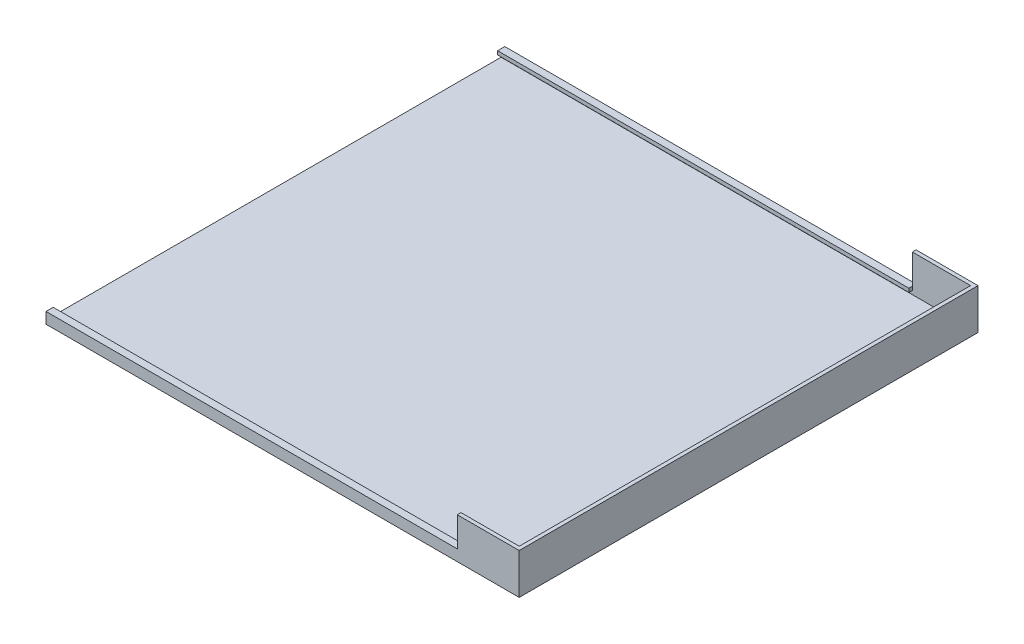
ISO-10303-21;
HEADER;
FILE_DESCRIPTION(('STEP AP214'),'2;1');
FILE_NAME('part.step','',(''),(''),'','','');
FILE_SCHEMA(('AUTOMOTIVE_DESIGN { 1 0 10303 214 1 1 1 1 }'));
ENDSEC;
DATA;
#1=APPLICATION_CONTEXT('core data for automotive mechanical design processes');
#2=APPLICATION_PROTOCOL_DEFINITION('international standard','automotive_design',2000,#1);
#3=PRODUCT_CONTEXT('',#1,'mechanical');
#4=PRODUCT('Part','Part','',(#3));
#5=PRODUCT_RELATED_PRODUCT_CATEGORY('part','',(#4));
#6=PRODUCT_DEFINITION_FORMATION('','',#4);
#7=PRODUCT_DEFINITION_CONTEXT('part definition',#1,'design');
#8=PRODUCT_DEFINITION('design','',#6,#7);
#9=PRODUCT_DEFINITION_SHAPE('','',#8);
#10=(LENGTH_UNIT() NAMED_UNIT(*) SI_UNIT(.MILLI.,.METRE.));
#11=(NAMED_UNIT(*) PLANE_ANGLE_UNIT() SI_UNIT($,.RADIAN.));
#12=(NAMED_UNIT(*) SI_UNIT($,.STERADIAN.) SOLID_ANGLE_UNIT());
#13=UNCERTAINTY_MEASURE_WITH_UNIT(LENGTH_MEASURE(1.E-05),#10,'distance_accuracy_value','');
#14=(GEOMETRIC_REPRESENTATION_CONTEXT(3) GLOBAL_UNCERTAINTY_ASSIGNED_CONTEXT((#13)) GLOBAL_UNIT_ASSIGNED_CONTEXT((#10,
#11,#12)) REPRESENTATION_CONTEXT('',''));
#15=CARTESIAN_POINT('',(0.,0.,0.));
#16=DIRECTION('',(0.,0.,1.));
#17=DIRECTION('',(1.,0.,0.));
#18=AXIS2_PLACEMENT_3D('',#15,#16,#17);
#19=CARTESIAN_POINT('',(0.,2.,0.));
#20=DIRECTION('',(0.,1.,0.));
#21=DIRECTION('',(0.,0.,1.));
#22=AXIS2_PLACEMENT_3D('',#19,#20,#21);
#23=PLANE('',#22);
#24=DIRECTION('',(0.,0.,1.));
#25=VECTOR('',#24,1.);
#26=CARTESIAN_POINT('',(126.,2.,122.1));
#27=LINE('',#26,#25);
#28=CARTESIAN_POINT('',(126.,2.,-122.1));
#29=VERTEX_POINT('',#28);
#30=CARTESIAN_POINT('',(126.,2.,122.1));
#31=VERTEX_POINT('',#30);
#32=EDGE_CURVE('E194',#29,#31,#27,.T.);
#33=ORIENTED_EDGE('',*,*,#32,.F.);
#34=DIRECTION('',(1.,0.,0.));
#35=VECTOR('',#34,1.);
#36=CARTESIAN_POINT('',(-128.,2.,-122.1));
#37=LINE('',#36,#35);
#38=CARTESIAN_POINT('',(-128.,2.,-122.1));
#39=VERTEX_POINT('',#38);
#40=EDGE_CURVE('E61',#39,#29,#37,.T.);
#41=ORIENTED_EDGE('',*,*,#40,.F.);
#42=DIRECTION('',(0.,0.,1.));
#43=VECTOR('',#42,1.);
#44=CARTESIAN_POINT('',(-128.,2.,-124.1));
#45=LINE('',#44,#43);
#46=CARTESIAN_POINT('',(-128.,2.,122.1));
#47=VERTEX_POINT('',#46);
#48=EDGE_CURVE('E179',#39,#47,#45,.T.);
#49=ORIENTED_EDGE('',*,*,#48,.T.);
#50=DIRECTION('',(-1.,0.,0.));
#51=VECTOR('',#50,1.);
#52=CARTESIAN_POINT('',(-128.,2.,122.1));
#53=LINE('',#52,#51);
#54=EDGE_CURVE('E68',#31,#47,#53,.T.);
#55=ORIENTED_EDGE('',*,*,#54,.F.);
#56=EDGE_LOOP('',(#33,#41,#49,#55));
#57=FACE_BOUND('',#56,.T.);
#58=ADVANCED_FACE('F45',(#57),#23,.T.);
#59=CARTESIAN_POINT('',(94.5000000000001,12.,-124.1));
#60=DIRECTION('',(1.,0.,0.));
#61=DIRECTION('',(0.,0.,-1.));
#62=AXIS2_PLACEMENT_3D('',#59,#60,#61);
#63=PLANE('',#62);
#64=DIRECTION('',(0.,0.,-1.));
#65=VECTOR('',#64,1.);
#66=CARTESIAN_POINT('',(94.5000000000001,4.,-120.21));
#67=LINE('',#66,#65);
#68=CARTESIAN_POINT('',(94.5000000000001,4.,-120.21));
#69=VERTEX_POINT('',#68);
#70=CARTESIAN_POINT('',(94.5000000000001,4.,-122.1));
#71=VERTEX_POINT('',#70);
#72=EDGE_CURVE('E238',#69,#71,#67,.T.);
#73=ORIENTED_EDGE('',*,*,#72,.T.);
#74=DIRECTION('',(0.,1.,0.));
#75=VECTOR('',#74,1.);
#76=CARTESIAN_POINT('',(94.5000000000001,12.,-122.1));
#77=LINE('',#76,#75);
#78=CARTESIAN_POINT('',(94.5000000000001,6.,-122.1));
#79=VERTEX_POINT('',#78);
#80=EDGE_CURVE('E11',#71,#79,#77,.T.);
#81=ORIENTED_EDGE('',*,*,#80,.T.);
#82=DIRECTION('',(0.,0.,-1.));
#83=VECTOR('',#82,1.);
#84=CARTESIAN_POINT('',(94.5000000000001,6.,0.));
#85=LINE('',#84,#83);
#86=CARTESIAN_POINT('',(94.5000000000001,6.,-120.21));
#87=VERTEX_POINT('',#86);
#88=EDGE_CURVE('E242',#87,#79,#85,.T.);
#89=ORIENTED_EDGE('',*,*,#88,.F.);
#90=DIRECTION('',(0.,1.,0.));
#91=VECTOR('',#90,1.);
#92=CARTESIAN_POINT('',(94.5000000000001,0.,-120.21));
#93=LINE('',#92,#91);
#94=EDGE_CURVE('E336',#69,#87,#93,.T.);
#95=ORIENTED_EDGE('',*,*,#94,.F.);
#96=EDGE_LOOP('',(#73,#81,#89,#95));
#97=FACE_BOUND('',#96,.T.);
#98=ADVANCED_FACE('F413',(#97),#63,.T.);
#99=CARTESIAN_POINT('',(94.5000000000001,12.,120.21));
#100=DIRECTION('',(1.,0.,0.));
#101=DIRECTION('',(0.,0.,-1.));
#102=AXIS2_PLACEMENT_3D('',#99,#100,#101);
#103=PLANE('',#102);
#104=DIRECTION('',(0.,0.,1.));
#105=VECTOR('',#104,1.);
#106=CARTESIAN_POINT('',(94.5000000000001,6.,0.));
#107=LINE('',#106,#105);
#108=CARTESIAN_POINT('',(94.5000000000001,6.,120.21));
#109=VERTEX_POINT('',#108);
#110=CARTESIAN_POINT('',(94.5000000000001,6.,122.1));
#111=VERTEX_POINT('',#110);
#112=EDGE_CURVE('E250',#109,#111,#107,.T.);
#113=ORIENTED_EDGE('',*,*,#112,.T.);
#114=DIRECTION('',(0.,-1.,0.));
#115=VECTOR('',#114,1.);
#116=CARTESIAN_POINT('',(94.5000000000001,12.,122.1));
#117=LINE('',#116,#115);
#118=CARTESIAN_POINT('',(94.5000000000001,4.00058035191791,122.1));
#119=VERTEX_POINT('',#118);
#120=EDGE_CURVE('E54',#111,#119,#117,.T.);
#121=ORIENTED_EDGE('',*,*,#120,.T.);
#122=DIRECTION('',(0.,0.,-1.));
#123=VECTOR('',#122,1.);
#124=CARTESIAN_POINT('',(94.5000000000001,4.00058035191792,120.21));
#125=LINE('',#124,#123);
#126=CARTESIAN_POINT('',(94.5000000000001,4.00058035191792,120.21));
#127=VERTEX_POINT('',#126);
#128=EDGE_CURVE('E246',#119,#127,#125,.T.);
#129=ORIENTED_EDGE('',*,*,#128,.T.);
#130=DIRECTION('',(0.,-1.,0.));
#131=VECTOR('',#130,1.);
#132=CARTESIAN_POINT('',(94.5000000000001,0.,120.21));
#133=LINE('',#132,#131);
#134=EDGE_CURVE('E340',#109,#127,#133,.T.);
#135=ORIENTED_EDGE('',*,*,#134,.F.);
#136=EDGE_LOOP('',(#113,#121,#129,#135));
#137=FACE_BOUND('',#136,.T.);
#138=ADVANCED_FACE('F347',(#137),#103,.T.);
#139=CARTESIAN_POINT('',(-128.,6.,-122.1));
#140=DIRECTION('',(0.,0.,-1.));
#141=DIRECTION('',(-1.,0.,0.));
#142=AXIS2_PLACEMENT_3D('',#139,#140,#141);
#143=PLANE('',#142);
#144=ORIENTED_EDGE('',*,*,#40,.T.);
#145=DIRECTION('',(0.,-1.,0.));
#146=VECTOR('',#145,1.);
#147=CARTESIAN_POINT('',(126.,22.,-122.1));
#148=LINE('',#147,#146);
#149=CARTESIAN_POINT('',(126.,22.,-122.1));
#150=VERTEX_POINT('',#149);
#151=EDGE_CURVE('E226',#150,#29,#148,.T.);
#152=ORIENTED_EDGE('',*,*,#151,.F.);
#153=DIRECTION('',(1.,0.,0.));
#154=VECTOR('',#153,1.);
#155=CARTESIAN_POINT('',(126.,22.,-122.1));
#156=LINE('',#155,#154);
#157=CARTESIAN_POINT('',(94.5000000000001,22.,-122.1));
#158=VERTEX_POINT('',#157);
#159=EDGE_CURVE('E204',#158,#150,#156,.T.);
#160=ORIENTED_EDGE('',*,*,#159,.F.);
#161=DIRECTION('',(0.,-1.,0.));
#162=VECTOR('',#161,1.);
#163=CARTESIAN_POINT('',(94.5000000000001,22.,-122.1));
#164=LINE('',#163,#162);
#165=EDGE_CURVE('E230',#158,#79,#164,.T.);
#166=ORIENTED_EDGE('',*,*,#165,.T.);
#167=ORIENTED_EDGE('',*,*,#80,.F.);
#168=DIRECTION('',(1.,0.,0.));
#169=VECTOR('',#168,1.);
#170=CARTESIAN_POINT('',(-128.,4.,-122.1));
#171=LINE('',#170,#169);
#172=CARTESIAN_POINT('',(-128.,4.,-122.1));
#173=VERTEX_POINT('',#172);
#174=EDGE_CURVE('E254',#173,#71,#171,.T.);
#175=ORIENTED_EDGE('',*,*,#174,.F.);
#176=DIRECTION('',(0.,-1.,0.));
#177=VECTOR('',#176,1.);
#178=CARTESIAN_POINT('',(-128.,6.,-122.1));
#179=LINE('',#178,#177);
#180=EDGE_CURVE('E290',#173,#39,#179,.T.);
#181=ORIENTED_EDGE('',*,*,#180,.T.);
#182=EDGE_LOOP('',(#144,#152,#160,#166,#167,#175,#181));
#183=FACE_BOUND('',#182,.T.);
#184=ADVANCED_FACE('F380',(#183),#143,.F.);
#185=CARTESIAN_POINT('',(-128.,6.,122.1));
#186=DIRECTION('',(0.,0.,1.));
#187=DIRECTION('',(1.,0.,0.));
#188=AXIS2_PLACEMENT_3D('',#185,#186,#187);
#189=PLANE('',#188);
#190=DIRECTION('',(-1.,0.,0.));
#191=VECTOR('',#190,1.);
#192=CARTESIAN_POINT('',(128.,4.00058035191792,122.1));
#193=LINE('',#192,#191);
#194=CARTESIAN_POINT('',(-128.,4.00058035191792,122.1));
#195=VERTEX_POINT('',#194);
#196=EDGE_CURVE('E272',#119,#195,#193,.T.);
#197=ORIENTED_EDGE('',*,*,#196,.F.);
#198=ORIENTED_EDGE('',*,*,#120,.F.);
#199=DIRECTION('',(0.,-1.,0.));
#200=VECTOR('',#199,1.);
#201=CARTESIAN_POINT('',(94.5000000000001,22.,122.1));
#202=LINE('',#201,#200);
#203=CARTESIAN_POINT('',(94.5000000000001,22.,122.1));
#204=VERTEX_POINT('',#203);
#205=EDGE_CURVE('E218',#204,#111,#202,.T.);
#206=ORIENTED_EDGE('',*,*,#205,.F.);
#207=DIRECTION('',(-1.,0.,0.));
#208=VECTOR('',#207,1.);
#209=CARTESIAN_POINT('',(94.5000000000001,22.,122.1));
#210=LINE('',#209,#208);
#211=CARTESIAN_POINT('',(126.,22.,122.1));
#212=VERTEX_POINT('',#211);
#213=EDGE_CURVE('E210',#212,#204,#210,.T.);
#214=ORIENTED_EDGE('',*,*,#213,.F.);
#215=DIRECTION('',(0.,-1.,0.));
#216=VECTOR('',#215,1.);
#217=CARTESIAN_POINT('',(126.,22.,122.1));
#218=LINE('',#217,#216);
#219=EDGE_CURVE('E222',#212,#31,#218,.T.);
#220=ORIENTED_EDGE('',*,*,#219,.T.);
#221=ORIENTED_EDGE('',*,*,#54,.T.);
#222=DIRECTION('',(0.,-1.,0.));
#223=VECTOR('',#222,1.);
#224=CARTESIAN_POINT('',(-128.,6.,122.1));
#225=LINE('',#224,#223);
#226=EDGE_CURVE('E298',#195,#47,#225,.T.);
#227=ORIENTED_EDGE('',*,*,#226,.F.);
#228=EDGE_LOOP('',(#197,#198,#206,#214,#220,#221,#227));
#229=FACE_BOUND('',#228,.T.);
#230=ADVANCED_FACE('F352',(#229),#189,.F.);
#231=CARTESIAN_POINT('',(128.,2.,-124.1));
#232=DIRECTION('',(-1.,0.,0.));
#233=DIRECTION('',(0.,0.,1.));
#234=AXIS2_PLACEMENT_3D('',#231,#232,#233);
#235=PLANE('',#234);
#236=DIRECTION('',(0.,-1.,0.));
#237=VECTOR('',#236,1.);
#238=CARTESIAN_POINT('',(128.,2.,-124.1));
#239=LINE('',#238,#237);
#240=CARTESIAN_POINT('',(128.,22.,-124.1));
#241=VERTEX_POINT('',#240);
#242=CARTESIAN_POINT('',(128.,0.,-124.1));
#243=VERTEX_POINT('',#242);
#244=EDGE_CURVE('E183',#241,#243,#239,.T.);
#245=ORIENTED_EDGE('',*,*,#244,.F.);
#246=DIRECTION('',(0.,0.,-1.));
#247=VECTOR('',#246,1.);
#248=CARTESIAN_POINT('',(128.,22.,124.1));
#249=LINE('',#248,#247);
#250=CARTESIAN_POINT('',(128.,22.,124.1));
#251=VERTEX_POINT('',#250);
#252=EDGE_CURVE('E182',#251,#241,#249,.T.);
#253=ORIENTED_EDGE('',*,*,#252,.F.);
#254=DIRECTION('',(0.,-1.,0.));
#255=VECTOR('',#254,1.);
#256=CARTESIAN_POINT('',(128.,2.,124.1));
#257=LINE('',#256,#255);
#258=CARTESIAN_POINT('',(128.,0.,124.1));
#259=VERTEX_POINT('',#258);
#260=EDGE_CURVE('E165',#251,#259,#257,.T.);
#261=ORIENTED_EDGE('',*,*,#260,.T.);
#262=DIRECTION('',(0.,0.,-1.));
#263=VECTOR('',#262,1.);
#264=CARTESIAN_POINT('',(128.,0.,-124.1));
#265=LINE('',#264,#263);
#266=EDGE_CURVE('E304',#259,#243,#265,.T.);
#267=ORIENTED_EDGE('',*,*,#266,.T.);
#268=EDGE_LOOP('',(#245,#253,#261,#267));
#269=FACE_BOUND('',#268,.T.);
#270=ADVANCED_FACE('F47',(#269),#235,.F.);
#271=CARTESIAN_POINT('',(-128.,2.,-124.1));
#272=DIRECTION('',(0.,0.,1.));
#273=DIRECTION('',(1.,0.,0.));
#274=AXIS2_PLACEMENT_3D('',#271,#272,#273);
#275=PLANE('',#274);
#276=DIRECTION('',(-1.,0.,0.));
#277=VECTOR('',#276,1.);
#278=CARTESIAN_POINT('',(-128.,6.,-124.1));
#279=LINE('',#278,#277);
#280=CARTESIAN_POINT('',(94.5000000000001,6.,-124.1));
#281=VERTEX_POINT('',#280);
#282=CARTESIAN_POINT('',(-128.,6.,-124.1));
#283=VERTEX_POINT('',#282);
#284=EDGE_CURVE('E307',#281,#283,#279,.T.);
#285=ORIENTED_EDGE('',*,*,#284,.F.);
#286=DIRECTION('',(0.,-1.,0.));
#287=VECTOR('',#286,1.);
#288=CARTESIAN_POINT('',(94.5000000000001,22.,-124.1));
#289=LINE('',#288,#287);
#290=CARTESIAN_POINT('',(94.5000000000001,22.,-124.1));
#291=VERTEX_POINT('',#290);
#292=EDGE_CURVE('E234',#291,#281,#289,.T.);
#293=ORIENTED_EDGE('',*,*,#292,.F.);
#294=DIRECTION('',(-1.,0.,0.));
#295=VECTOR('',#294,1.);
#296=CARTESIAN_POINT('',(128.,22.,-124.1));
#297=LINE('',#296,#295);
#298=EDGE_CURVE('E187',#241,#291,#297,.T.);
#299=ORIENTED_EDGE('',*,*,#298,.F.);
#300=ORIENTED_EDGE('',*,*,#244,.T.);
#301=DIRECTION('',(-1.,0.,0.));
#302=VECTOR('',#301,1.);
#303=CARTESIAN_POINT('',(-128.,0.,-124.1));
#304=LINE('',#303,#302);
#305=CARTESIAN_POINT('',(-128.,0.,-124.1));
#306=VERTEX_POINT('',#305);
#307=EDGE_CURVE('E320',#243,#306,#304,.T.);
#308=ORIENTED_EDGE('',*,*,#307,.T.);
#309=DIRECTION('',(0.,-1.,0.));
#310=VECTOR('',#309,1.);
#311=CARTESIAN_POINT('',(-128.,2.,-124.1));
#312=LINE('',#311,#310);
#313=EDGE_CURVE('E330',#283,#306,#312,.T.);
#314=ORIENTED_EDGE('',*,*,#313,.F.);
#315=EDGE_LOOP('',(#285,#293,#299,#300,#308,#314));
#316=FACE_BOUND('',#315,.T.);
#317=ADVANCED_FACE('F397',(#316),#275,.F.);
#318=CARTESIAN_POINT('',(-128.,2.,124.1));
#319=DIRECTION('',(0.,0.,-1.));
#320=DIRECTION('',(-1.,0.,0.));
#321=AXIS2_PLACEMENT_3D('',#318,#319,#320);
#322=PLANE('',#321);
#323=ORIENTED_EDGE('',*,*,#260,.F.);
#324=DIRECTION('',(1.,0.,0.));
#325=VECTOR('',#324,1.);
#326=CARTESIAN_POINT('',(94.5000000000001,22.,124.1));
#327=LINE('',#326,#325);
#328=CARTESIAN_POINT('',(94.5000000000001,22.,124.1));
#329=VERTEX_POINT('',#328);
#330=EDGE_CURVE('E170',#329,#251,#327,.T.);
#331=ORIENTED_EDGE('',*,*,#330,.F.);
#332=DIRECTION('',(0.,-1.,0.));
#333=VECTOR('',#332,1.);
#334=CARTESIAN_POINT('',(94.5000000000001,22.,124.1));
#335=LINE('',#334,#333);
#336=CARTESIAN_POINT('',(94.5000000000001,6.,124.1));
#337=VERTEX_POINT('',#336);
#338=EDGE_CURVE('E214',#329,#337,#335,.T.);
#339=ORIENTED_EDGE('',*,*,#338,.T.);
#340=DIRECTION('',(1.,0.,0.));
#341=VECTOR('',#340,1.);
#342=CARTESIAN_POINT('',(-128.,6.,124.1));
#343=LINE('',#342,#341);
#344=CARTESIAN_POINT('',(-128.,6.,124.1));
#345=VERTEX_POINT('',#344);
#346=EDGE_CURVE('E295',#345,#337,#343,.T.);
#347=ORIENTED_EDGE('',*,*,#346,.F.);
#348=DIRECTION('',(0.,-1.,0.));
#349=VECTOR('',#348,1.);
#350=CARTESIAN_POINT('',(-128.,2.,124.1));
#351=LINE('',#350,#349);
#352=CARTESIAN_POINT('',(-128.,0.,124.1));
#353=VERTEX_POINT('',#352);
#354=EDGE_CURVE('E178',#345,#353,#351,.T.);
#355=ORIENTED_EDGE('',*,*,#354,.T.);
#356=DIRECTION('',(1.,0.,0.));
#357=VECTOR('',#356,1.);
#358=CARTESIAN_POINT('',(-128.,0.,124.1));
#359=LINE('',#358,#357);
#360=EDGE_CURVE('E173',#353,#259,#359,.T.);
#361=ORIENTED_EDGE('',*,*,#360,.T.);
#362=EDGE_LOOP('',(#323,#331,#339,#347,#355,#361));
#363=FACE_BOUND('',#362,.T.);
#364=ADVANCED_FACE('F167',(#363),#322,.F.);
#365=CARTESIAN_POINT('',(0.,6.,0.));
#366=DIRECTION('',(0.,1.,0.));
#367=DIRECTION('',(0.,0.,1.));
#368=AXIS2_PLACEMENT_3D('',#365,#366,#367);
#369=PLANE('',#368);
#370=DIRECTION('',(-1.,0.,0.));
#371=VECTOR('',#370,1.);
#372=CARTESIAN_POINT('',(-128.,6.,-120.21));
#373=LINE('',#372,#371);
#374=CARTESIAN_POINT('',(-128.,6.,-120.21));
#375=VERTEX_POINT('',#374);
#376=EDGE_CURVE('E263',#87,#375,#373,.T.);
#377=ORIENTED_EDGE('',*,*,#376,.F.);
#378=ORIENTED_EDGE('',*,*,#88,.T.);
#379=EDGE_CURVE('E241',#79,#281,#85,.T.);
#380=ORIENTED_EDGE('',*,*,#379,.T.);
#381=ORIENTED_EDGE('',*,*,#284,.T.);
#382=DIRECTION('',(0.,0.,1.));
#383=VECTOR('',#382,1.);
#384=CARTESIAN_POINT('',(-128.,6.,-124.1));
#385=LINE('',#384,#383);
#386=EDGE_CURVE('E310',#283,#375,#385,.T.);
#387=ORIENTED_EDGE('',*,*,#386,.T.);
#388=EDGE_LOOP('',(#377,#378,#380,#381,#387));
#389=FACE_BOUND('',#388,.T.);
#390=ADVANCED_FACE('F392',(#389),#369,.T.);
#391=CARTESIAN_POINT('',(0.,6.,0.));
#392=DIRECTION('',(0.,-1.,0.));
#393=DIRECTION('',(0.,0.,-1.));
#394=AXIS2_PLACEMENT_3D('',#391,#392,#393);
#395=PLANE('',#394);
#396=ORIENTED_EDGE('',*,*,#112,.F.);
#397=DIRECTION('',(1.,0.,0.));
#398=VECTOR('',#397,1.);
#399=CARTESIAN_POINT('',(128.,6.,120.21));
#400=LINE('',#399,#398);
#401=CARTESIAN_POINT('',(-128.,6.,120.21));
#402=VERTEX_POINT('',#401);
#403=EDGE_CURVE('E280',#402,#109,#400,.T.);
#404=ORIENTED_EDGE('',*,*,#403,.F.);
#405=DIRECTION('',(0.,0.,1.));
#406=VECTOR('',#405,1.);
#407=CARTESIAN_POINT('',(-128.,6.,124.1));
#408=LINE('',#407,#406);
#409=EDGE_CURVE('E291',#402,#345,#408,.T.);
#410=ORIENTED_EDGE('',*,*,#409,.T.);
#411=ORIENTED_EDGE('',*,*,#346,.T.);
#412=EDGE_CURVE('E249',#111,#337,#107,.T.);
#413=ORIENTED_EDGE('',*,*,#412,.F.);
#414=EDGE_LOOP('',(#396,#404,#410,#411,#413));
#415=FACE_BOUND('',#414,.T.);
#416=ADVANCED_FACE('F361',(#415),#395,.F.);
#417=CARTESIAN_POINT('',(128.,4.00058035191792,120.21));
#418=DIRECTION('',(0.,1.,0.));
#419=DIRECTION('',(0.,0.,1.));
#420=AXIS2_PLACEMENT_3D('',#417,#418,#419);
#421=PLANE('',#420);
#422=ORIENTED_EDGE('',*,*,#128,.F.);
#423=ORIENTED_EDGE('',*,*,#196,.T.);
#424=DIRECTION('',(0.,0.,1.));
#425=VECTOR('',#424,1.);
#426=CARTESIAN_POINT('',(-128.,4.00058035191792,120.21));
#427=LINE('',#426,#425);
#428=CARTESIAN_POINT('',(-128.,4.00058035191792,120.21));
#429=VERTEX_POINT('',#428);
#430=EDGE_CURVE('E284',#429,#195,#427,.T.);
#431=ORIENTED_EDGE('',*,*,#430,.F.);
#432=DIRECTION('',(-1.,0.,0.));
#433=VECTOR('',#432,1.);
#434=CARTESIAN_POINT('',(128.,4.00058035191792,120.21));
#435=LINE('',#434,#433);
#436=EDGE_CURVE('E273',#127,#429,#435,.T.);
#437=ORIENTED_EDGE('',*,*,#436,.F.);
#438=EDGE_LOOP('',(#422,#423,#431,#437));
#439=FACE_BOUND('',#438,.T.);
#440=ADVANCED_FACE('F370',(#439),#421,.F.);
#441=CARTESIAN_POINT('',(0.,0.,120.21));
#442=DIRECTION('',(0.,0.,-1.));
#443=DIRECTION('',(-1.,0.,0.));
#444=AXIS2_PLACEMENT_3D('',#441,#442,#443);
#445=PLANE('',#444);
#446=ORIENTED_EDGE('',*,*,#403,.T.);
#447=ORIENTED_EDGE('',*,*,#134,.T.);
#448=ORIENTED_EDGE('',*,*,#436,.T.);
#449=DIRECTION('',(0.,1.,0.));
#450=VECTOR('',#449,1.);
#451=CARTESIAN_POINT('',(-128.,6.,120.21));
#452=LINE('',#451,#450);
#453=EDGE_CURVE('E276',#429,#402,#452,.T.);
#454=ORIENTED_EDGE('',*,*,#453,.T.);
#455=EDGE_LOOP('',(#446,#447,#448,#454));
#456=FACE_BOUND('',#455,.T.);
#457=ADVANCED_FACE('F366',(#456),#445,.T.);
#458=CARTESIAN_POINT('',(-128.,4.,-120.21));
#459=DIRECTION('',(0.,1.,0.));
#460=DIRECTION('',(0.,0.,1.));
#461=AXIS2_PLACEMENT_3D('',#458,#459,#460);
#462=PLANE('',#461);
#463=ORIENTED_EDGE('',*,*,#72,.F.);
#464=DIRECTION('',(1.,0.,0.));
#465=VECTOR('',#464,1.);
#466=CARTESIAN_POINT('',(-128.,4.,-120.21));
#467=LINE('',#466,#465);
#468=CARTESIAN_POINT('',(-128.,4.,-120.21));
#469=VERTEX_POINT('',#468);
#470=EDGE_CURVE('E259',#469,#69,#467,.T.);
#471=ORIENTED_EDGE('',*,*,#470,.F.);
#472=DIRECTION('',(0.,0.,-1.));
#473=VECTOR('',#472,1.);
#474=CARTESIAN_POINT('',(-128.,4.,-120.21));
#475=LINE('',#474,#473);
#476=EDGE_CURVE('E266',#469,#173,#475,.T.);
#477=ORIENTED_EDGE('',*,*,#476,.T.);
#478=ORIENTED_EDGE('',*,*,#174,.T.);
#479=EDGE_LOOP('',(#463,#471,#477,#478));
#480=FACE_BOUND('',#479,.T.);
#481=ADVANCED_FACE('F384',(#480),#462,.F.);
#482=CARTESIAN_POINT('',(0.,0.,-120.21));
#483=DIRECTION('',(0.,0.,1.));
#484=DIRECTION('',(1.,0.,0.));
#485=AXIS2_PLACEMENT_3D('',#482,#483,#484);
#486=PLANE('',#485);
#487=ORIENTED_EDGE('',*,*,#470,.T.);
#488=ORIENTED_EDGE('',*,*,#94,.T.);
#489=ORIENTED_EDGE('',*,*,#376,.T.);
#490=DIRECTION('',(0.,-1.,0.));
#491=VECTOR('',#490,1.);
#492=CARTESIAN_POINT('',(-128.,6.,-120.21));
#493=LINE('',#492,#491);
#494=EDGE_CURVE('E255',#375,#469,#493,.T.);
#495=ORIENTED_EDGE('',*,*,#494,.T.);
#496=EDGE_LOOP('',(#487,#488,#489,#495));
#497=FACE_BOUND('',#496,.T.);
#498=ADVANCED_FACE('F386',(#497),#486,.T.);
#499=CARTESIAN_POINT('',(-128.,2.,-124.1));
#500=DIRECTION('',(1.,0.,0.));
#501=DIRECTION('',(0.,0.,-1.));
#502=AXIS2_PLACEMENT_3D('',#499,#500,#501);
#503=PLANE('',#502);
#504=DIRECTION('',(0.,0.,1.));
#505=VECTOR('',#504,1.);
#506=CARTESIAN_POINT('',(-128.,0.,-124.1));
#507=LINE('',#506,#505);
#508=EDGE_CURVE('E323',#306,#353,#507,.T.);
#509=ORIENTED_EDGE('',*,*,#508,.T.);
#510=ORIENTED_EDGE('',*,*,#354,.F.);
#511=ORIENTED_EDGE('',*,*,#409,.F.);
#512=ORIENTED_EDGE('',*,*,#453,.F.);
#513=ORIENTED_EDGE('',*,*,#430,.T.);
#514=ORIENTED_EDGE('',*,*,#226,.T.);
#515=ORIENTED_EDGE('',*,*,#48,.F.);
#516=ORIENTED_EDGE('',*,*,#180,.F.);
#517=ORIENTED_EDGE('',*,*,#476,.F.);
#518=ORIENTED_EDGE('',*,*,#494,.F.);
#519=ORIENTED_EDGE('',*,*,#386,.F.);
#520=ORIENTED_EDGE('',*,*,#313,.T.);
#521=EDGE_LOOP('',(#509,#510,#511,#512,#513,#514,#515,#516,#517,#518,#519,#520));
#522=FACE_BOUND('',#521,.T.);
#523=ADVANCED_FACE('F364',(#522),#503,.F.);
#524=CARTESIAN_POINT('',(0.,0.,0.));
#525=DIRECTION('',(0.,1.,0.));
#526=DIRECTION('',(0.,0.,1.));
#527=AXIS2_PLACEMENT_3D('',#524,#525,#526);
#528=PLANE('',#527);
#529=ORIENTED_EDGE('',*,*,#266,.F.);
#530=ORIENTED_EDGE('',*,*,#360,.F.);
#531=ORIENTED_EDGE('',*,*,#508,.F.);
#532=ORIENTED_EDGE('',*,*,#307,.F.);
#533=EDGE_LOOP('',(#529,#530,#531,#532));
#534=FACE_BOUND('',#533,.T.);
#535=ADVANCED_FACE('F400',(#534),#528,.F.);
#536=CARTESIAN_POINT('',(94.5000000000001,22.,124.1));
#537=DIRECTION('',(1.,0.,0.));
#538=DIRECTION('',(0.,0.,-1.));
#539=AXIS2_PLACEMENT_3D('',#536,#537,#538);
#540=PLANE('',#539);
#541=ORIENTED_EDGE('',*,*,#205,.T.);
#542=ORIENTED_EDGE('',*,*,#412,.T.);
#543=ORIENTED_EDGE('',*,*,#338,.F.);
#544=DIRECTION('',(0.,0.,1.));
#545=VECTOR('',#544,1.);
#546=CARTESIAN_POINT('',(94.5000000000001,22.,124.1));
#547=LINE('',#546,#545);
#548=EDGE_CURVE('E191',#204,#329,#547,.T.);
#549=ORIENTED_EDGE('',*,*,#548,.F.);
#550=EDGE_LOOP('',(#541,#542,#543,#549));
#551=FACE_BOUND('',#550,.T.);
#552=ADVANCED_FACE('F357',(#551),#540,.F.);
#553=CARTESIAN_POINT('',(94.5000000000001,22.,-122.1));
#554=DIRECTION('',(1.,0.,0.));
#555=DIRECTION('',(0.,0.,-1.));
#556=AXIS2_PLACEMENT_3D('',#553,#554,#555);
#557=PLANE('',#556);
#558=ORIENTED_EDGE('',*,*,#379,.F.);
#559=ORIENTED_EDGE('',*,*,#165,.F.);
#560=DIRECTION('',(0.,0.,1.));
#561=VECTOR('',#560,1.);
#562=CARTESIAN_POINT('',(94.5000000000001,22.,-122.1));
#563=LINE('',#562,#561);
#564=EDGE_CURVE('E201',#291,#158,#563,.T.);
#565=ORIENTED_EDGE('',*,*,#564,.F.);
#566=ORIENTED_EDGE('',*,*,#292,.T.);
#567=EDGE_LOOP('',(#558,#559,#565,#566));
#568=FACE_BOUND('',#567,.T.);
#569=ADVANCED_FACE('F407',(#568),#557,.F.);
#570=CARTESIAN_POINT('',(126.,22.,122.1));
#571=DIRECTION('',(1.,0.,0.));
#572=DIRECTION('',(0.,0.,-1.));
#573=AXIS2_PLACEMENT_3D('',#570,#571,#572);
#574=PLANE('',#573);
#575=ORIENTED_EDGE('',*,*,#32,.T.);
#576=ORIENTED_EDGE('',*,*,#219,.F.);
#577=DIRECTION('',(0.,0.,1.));
#578=VECTOR('',#577,1.);
#579=CARTESIAN_POINT('',(126.,22.,122.1));
#580=LINE('',#579,#578);
#581=EDGE_CURVE('E207',#150,#212,#580,.T.);
#582=ORIENTED_EDGE('',*,*,#581,.F.);
#583=ORIENTED_EDGE('',*,*,#151,.T.);
#584=EDGE_LOOP('',(#575,#576,#582,#583));
#585=FACE_BOUND('',#584,.T.);
#586=ADVANCED_FACE('F375',(#585),#574,.F.);
#587=CARTESIAN_POINT('',(0.,22.,0.));
#588=DIRECTION('',(0.,1.,0.));
#589=DIRECTION('',(0.,0.,1.));
#590=AXIS2_PLACEMENT_3D('',#587,#588,#589);
#591=PLANE('',#590);
#592=ORIENTED_EDGE('',*,*,#330,.T.);
#593=ORIENTED_EDGE('',*,*,#252,.T.);
#594=ORIENTED_EDGE('',*,*,#298,.T.);
#595=ORIENTED_EDGE('',*,*,#564,.T.);
#596=ORIENTED_EDGE('',*,*,#159,.T.);
#597=ORIENTED_EDGE('',*,*,#581,.T.);
#598=ORIENTED_EDGE('',*,*,#213,.T.);
#599=ORIENTED_EDGE('',*,*,#548,.T.);
#600=EDGE_LOOP('',(#592,#593,#594,#595,#596,#597,#598,#599));
#601=FACE_BOUND('',#600,.T.);
#602=ADVANCED_FACE('F189',(#601),#591,.T.);
#603=CLOSED_SHELL('',(#58,#98,#138,#184,#230,#270,#317,#364,#390,#416,#440,#457,#481,#498,#523,
#535,#552,#569,#586,#602));
#604=MANIFOLD_SOLID_BREP('B2',#603);
#605=ADVANCED_BREP_SHAPE_REPRESENTATION('',(#18,#604),#14);
#606=SHAPE_DEFINITION_REPRESENTATION(#9,#605);
ENDSEC;
END-ISO-10303-21;
